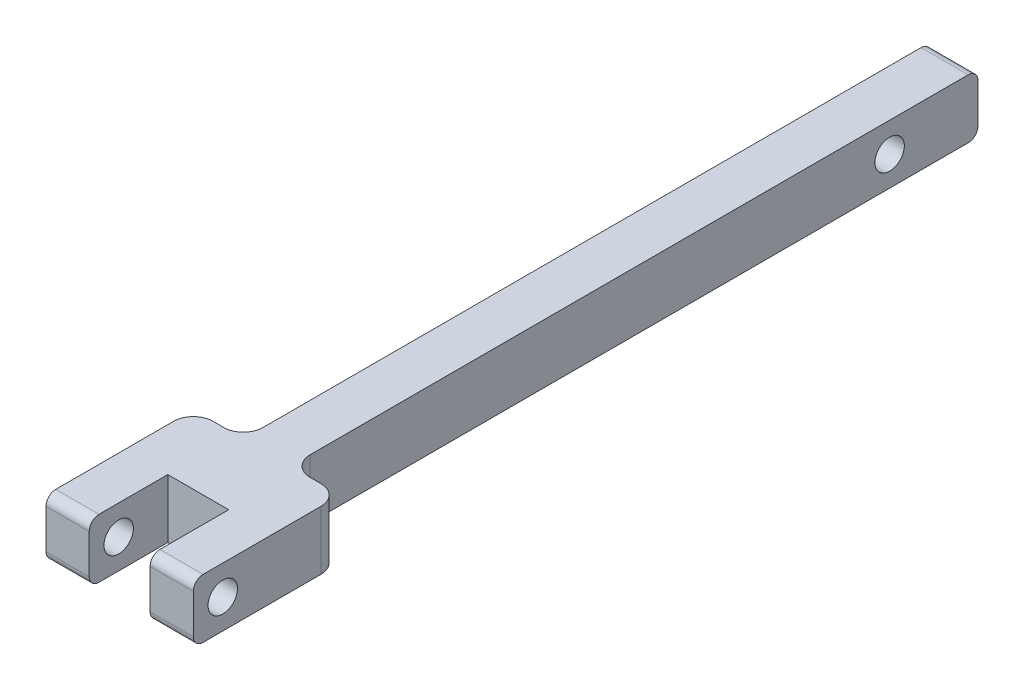
ISO-10303-21;
HEADER;
FILE_DESCRIPTION(('STEP AP214'),'2;1');
FILE_NAME('part.step','',(''),(''),'','','');
FILE_SCHEMA(('AUTOMOTIVE_DESIGN { 1 0 10303 214 1 1 1 1 }'));
ENDSEC;
DATA;
#1=APPLICATION_CONTEXT('core data for automotive mechanical design processes');
#2=APPLICATION_PROTOCOL_DEFINITION('international standard','automotive_design',2000,#1);
#3=PRODUCT_CONTEXT('',#1,'mechanical');
#4=PRODUCT('Part','Part','',(#3));
#5=PRODUCT_RELATED_PRODUCT_CATEGORY('part','',(#4));
#6=PRODUCT_DEFINITION_FORMATION('','',#4);
#7=PRODUCT_DEFINITION_CONTEXT('part definition',#1,'design');
#8=PRODUCT_DEFINITION('design','',#6,#7);
#9=PRODUCT_DEFINITION_SHAPE('','',#8);
#10=(LENGTH_UNIT() NAMED_UNIT(*) SI_UNIT(.MILLI.,.METRE.));
#11=(NAMED_UNIT(*) PLANE_ANGLE_UNIT() SI_UNIT($,.RADIAN.));
#12=(NAMED_UNIT(*) SI_UNIT($,.STERADIAN.) SOLID_ANGLE_UNIT());
#13=UNCERTAINTY_MEASURE_WITH_UNIT(LENGTH_MEASURE(1.E-05),#10,'distance_accuracy_value','');
#14=(GEOMETRIC_REPRESENTATION_CONTEXT(3) GLOBAL_UNCERTAINTY_ASSIGNED_CONTEXT((#13)) GLOBAL_UNIT_ASSIGNED_CONTEXT((#10,
#11,#12)) REPRESENTATION_CONTEXT('',''));
#15=CARTESIAN_POINT('',(0.,0.,0.));
#16=DIRECTION('',(0.,0.,1.));
#17=DIRECTION('',(1.,0.,0.));
#18=AXIS2_PLACEMENT_3D('',#15,#16,#17);
#19=CARTESIAN_POINT('',(2.4,-2.,41.5));
#20=DIRECTION('',(-1.,0.,0.));
#21=DIRECTION('',(0.,0.,1.));
#22=AXIS2_PLACEMENT_3D('',#19,#20,#21);
#23=CYLINDRICAL_SURFACE('',#22,1.);
#24=CARTESIAN_POINT('',(-3.1,-2.,41.5));
#25=DIRECTION('',(1.,0.,0.));
#26=DIRECTION('',(0.,0.,-1.));
#27=AXIS2_PLACEMENT_3D('',#24,#25,#26);
#28=CIRCLE('',#27,1.);
#29=CARTESIAN_POINT('',(-3.1,-2.,42.5));
#30=VERTEX_POINT('',#29);
#31=CARTESIAN_POINT('',(-3.1,-3.,41.5));
#32=VERTEX_POINT('',#31);
#33=EDGE_CURVE('E201',#30,#32,#28,.T.);
#34=ORIENTED_EDGE('',*,*,#33,.F.);
#35=DIRECTION('',(-1.,0.,0.));
#36=VECTOR('',#35,1.);
#37=CARTESIAN_POINT('',(2.4,-2.,42.5));
#38=LINE('',#37,#36);
#39=CARTESIAN_POINT('',(-7.5,-2.,42.5));
#40=VERTEX_POINT('',#39);
#41=EDGE_CURVE('E200',#30,#40,#38,.T.);
#42=ORIENTED_EDGE('',*,*,#41,.T.);
#43=CARTESIAN_POINT('',(-7.5,-2.,41.5));
#44=DIRECTION('',(1.,0.,0.));
#45=DIRECTION('',(0.,0.,-1.));
#46=AXIS2_PLACEMENT_3D('',#43,#44,#45);
#47=CIRCLE('',#46,1.);
#48=CARTESIAN_POINT('',(-7.5,-3.,41.5));
#49=VERTEX_POINT('',#48);
#50=EDGE_CURVE('E358',#40,#49,#47,.T.);
#51=ORIENTED_EDGE('',*,*,#50,.T.);
#52=DIRECTION('',(-1.,0.,0.));
#53=VECTOR('',#52,1.);
#54=CARTESIAN_POINT('',(2.4,-3.,41.5));
#55=LINE('',#54,#53);
#56=EDGE_CURVE('E231',#32,#49,#55,.T.);
#57=ORIENTED_EDGE('',*,*,#56,.F.);
#58=EDGE_LOOP('',(#34,#42,#51,#57));
#59=FACE_BOUND('',#58,.T.);
#60=ADVANCED_FACE('F32',(#59),#23,.T.);
#61=CARTESIAN_POINT('',(2.4,-3.,41.5));
#62=DIRECTION('',(0.,1.,0.));
#63=DIRECTION('',(0.,0.,1.));
#64=AXIS2_PLACEMENT_3D('',#61,#62,#63);
#65=PLANE('',#64);
#66=DIRECTION('',(-1.,0.,0.));
#67=VECTOR('',#66,1.);
#68=CARTESIAN_POINT('',(7.5,-3.,27.5));
#69=LINE('',#68,#67);
#70=CARTESIAN_POINT('',(5.5,-3.,27.5));
#71=VERTEX_POINT('',#70);
#72=CARTESIAN_POINT('',(4.4,-3.,27.5));
#73=VERTEX_POINT('',#72);
#74=EDGE_CURVE('E370',#71,#73,#69,.T.);
#75=ORIENTED_EDGE('',*,*,#74,.F.);
#76=CARTESIAN_POINT('',(5.5,-3.,29.5));
#77=DIRECTION('',(0.,1.,0.));
#78=DIRECTION('',(0.,0.,1.));
#79=AXIS2_PLACEMENT_3D('',#76,#77,#78);
#80=CIRCLE('',#79,2.);
#81=CARTESIAN_POINT('',(7.5,-3.,29.5));
#82=VERTEX_POINT('',#81);
#83=EDGE_CURVE('E256',#71,#82,#80,.F.);
#84=ORIENTED_EDGE('',*,*,#83,.T.);
#85=DIRECTION('',(0.,0.,-1.));
#86=VECTOR('',#85,1.);
#87=CARTESIAN_POINT('',(7.5,-3.,27.5));
#88=LINE('',#87,#86);
#89=CARTESIAN_POINT('',(7.5,-3.,41.5));
#90=VERTEX_POINT('',#89);
#91=EDGE_CURVE('E344',#90,#82,#88,.T.);
#92=ORIENTED_EDGE('',*,*,#91,.F.);
#93=CARTESIAN_POINT('',(3.1,-3.,41.5));
#94=VERTEX_POINT('',#93);
#95=EDGE_CURVE('E232',#90,#94,#55,.T.);
#96=ORIENTED_EDGE('',*,*,#95,.T.);
#97=DIRECTION('',(0.,0.,-1.));
#98=VECTOR('',#97,1.);
#99=CARTESIAN_POINT('',(3.1,-3.,34.5));
#100=LINE('',#99,#98);
#101=CARTESIAN_POINT('',(3.1,-3.,34.5));
#102=VERTEX_POINT('',#101);
#103=EDGE_CURVE('E428',#94,#102,#100,.T.);
#104=ORIENTED_EDGE('',*,*,#103,.T.);
#105=DIRECTION('',(1.,0.,0.));
#106=VECTOR('',#105,1.);
#107=CARTESIAN_POINT('',(-3.1,-3.,34.5));
#108=LINE('',#107,#106);
#109=CARTESIAN_POINT('',(-3.1,-3.,34.5));
#110=VERTEX_POINT('',#109);
#111=EDGE_CURVE('E422',#110,#102,#108,.T.);
#112=ORIENTED_EDGE('',*,*,#111,.F.);
#113=DIRECTION('',(0.,0.,-1.));
#114=VECTOR('',#113,1.);
#115=CARTESIAN_POINT('',(-3.1,-3.,34.5));
#116=LINE('',#115,#114);
#117=EDGE_CURVE('E415',#32,#110,#116,.T.);
#118=ORIENTED_EDGE('',*,*,#117,.F.);
#119=ORIENTED_EDGE('',*,*,#56,.T.);
#120=DIRECTION('',(0.,0.,-1.));
#121=VECTOR('',#120,1.);
#122=CARTESIAN_POINT('',(-7.5,-3.,27.5));
#123=LINE('',#122,#121);
#124=CARTESIAN_POINT('',(-7.5,-3.,29.5));
#125=VERTEX_POINT('',#124);
#126=EDGE_CURVE('E361',#49,#125,#123,.T.);
#127=ORIENTED_EDGE('',*,*,#126,.T.);
#128=CARTESIAN_POINT('',(-5.5,-3.,29.5));
#129=DIRECTION('',(0.,1.,0.));
#130=DIRECTION('',(0.,0.,1.));
#131=AXIS2_PLACEMENT_3D('',#128,#129,#130);
#132=CIRCLE('',#131,2.);
#133=CARTESIAN_POINT('',(-5.5,-3.,27.5));
#134=VERTEX_POINT('',#133);
#135=EDGE_CURVE('E254',#125,#134,#132,.F.);
#136=ORIENTED_EDGE('',*,*,#135,.T.);
#137=CARTESIAN_POINT('',(-4.4,-3.,27.5));
#138=VERTEX_POINT('',#137);
#139=EDGE_CURVE('E367',#138,#134,#69,.T.);
#140=ORIENTED_EDGE('',*,*,#139,.F.);
#141=CARTESIAN_POINT('',(-4.4,-3.,25.5));
#142=DIRECTION('',(0.,1.,0.));
#143=DIRECTION('',(0.,0.,1.));
#144=AXIS2_PLACEMENT_3D('',#141,#142,#143);
#145=CIRCLE('',#144,2.);
#146=CARTESIAN_POINT('',(-2.4,-3.,25.5));
#147=VERTEX_POINT('',#146);
#148=EDGE_CURVE('E40',#138,#147,#145,.T.);
#149=ORIENTED_EDGE('',*,*,#148,.T.);
#150=DIRECTION('',(0.,0.,-1.));
#151=VECTOR('',#150,1.);
#152=CARTESIAN_POINT('',(-2.4,-3.,41.5));
#153=LINE('',#152,#151);
#154=CARTESIAN_POINT('',(-2.4,-3.,-41.5));
#155=VERTEX_POINT('',#154);
#156=EDGE_CURVE('E377',#147,#155,#153,.T.);
#157=ORIENTED_EDGE('',*,*,#156,.T.);
#158=DIRECTION('',(-1.,0.,0.));
#159=VECTOR('',#158,1.);
#160=CARTESIAN_POINT('',(2.4,-3.,-41.5));
#161=LINE('',#160,#159);
#162=CARTESIAN_POINT('',(2.4,-3.,-41.5));
#163=VERTEX_POINT('',#162);
#164=EDGE_CURVE('E228',#163,#155,#161,.T.);
#165=ORIENTED_EDGE('',*,*,#164,.F.);
#166=DIRECTION('',(0.,0.,-1.));
#167=VECTOR('',#166,1.);
#168=CARTESIAN_POINT('',(2.4,-3.,41.5));
#169=LINE('',#168,#167);
#170=CARTESIAN_POINT('',(2.4,-3.,25.5));
#171=VERTEX_POINT('',#170);
#172=EDGE_CURVE('E378',#171,#163,#169,.T.);
#173=ORIENTED_EDGE('',*,*,#172,.F.);
#174=CARTESIAN_POINT('',(4.4,-3.,25.5));
#175=DIRECTION('',(0.,1.,0.));
#176=DIRECTION('',(0.,0.,1.));
#177=AXIS2_PLACEMENT_3D('',#174,#175,#176);
#178=CIRCLE('',#177,2.);
#179=EDGE_CURVE('E47',#171,#73,#178,.T.);
#180=ORIENTED_EDGE('',*,*,#179,.T.);
#181=EDGE_LOOP('',(#75,#84,#92,#96,#104,#112,#118,#119,#127,#136,#140,#149,#157,#165,#173,#180));
#182=FACE_BOUND('',#181,.T.);
#183=ADVANCED_FACE('F301',(#182),#65,.F.);
#184=CARTESIAN_POINT('',(2.4,3.,41.5));
#185=DIRECTION('',(0.,-1.,0.));
#186=DIRECTION('',(0.,0.,-1.));
#187=AXIS2_PLACEMENT_3D('',#184,#185,#186);
#188=PLANE('',#187);
#189=DIRECTION('',(0.,0.,1.));
#190=VECTOR('',#189,1.);
#191=CARTESIAN_POINT('',(7.5,3.,41.5));
#192=LINE('',#191,#190);
#193=CARTESIAN_POINT('',(7.5,3.,29.5));
#194=VERTEX_POINT('',#193);
#195=CARTESIAN_POINT('',(7.5,3.,41.5));
#196=VERTEX_POINT('',#195);
#197=EDGE_CURVE('E351',#194,#196,#192,.T.);
#198=ORIENTED_EDGE('',*,*,#197,.F.);
#199=CARTESIAN_POINT('',(5.5,3.,29.5));
#200=DIRECTION('',(0.,-1.,0.));
#201=DIRECTION('',(0.,0.,-1.));
#202=AXIS2_PLACEMENT_3D('',#199,#200,#201);
#203=CIRCLE('',#202,2.);
#204=CARTESIAN_POINT('',(5.5,3.,27.5));
#205=VERTEX_POINT('',#204);
#206=EDGE_CURVE('E248',#194,#205,#203,.F.);
#207=ORIENTED_EDGE('',*,*,#206,.T.);
#208=DIRECTION('',(-1.,0.,0.));
#209=VECTOR('',#208,1.);
#210=CARTESIAN_POINT('',(7.5,3.,27.5));
#211=LINE('',#210,#209);
#212=CARTESIAN_POINT('',(4.4,3.,27.5));
#213=VERTEX_POINT('',#212);
#214=EDGE_CURVE('E281',#205,#213,#211,.T.);
#215=ORIENTED_EDGE('',*,*,#214,.T.);
#216=CARTESIAN_POINT('',(4.4,3.,25.5));
#217=DIRECTION('',(0.,-1.,0.));
#218=DIRECTION('',(0.,0.,-1.));
#219=AXIS2_PLACEMENT_3D('',#216,#217,#218);
#220=CIRCLE('',#219,2.);
#221=CARTESIAN_POINT('',(2.4,3.,25.5));
#222=VERTEX_POINT('',#221);
#223=EDGE_CURVE('E271',#213,#222,#220,.T.);
#224=ORIENTED_EDGE('',*,*,#223,.T.);
#225=DIRECTION('',(0.,0.,1.));
#226=VECTOR('',#225,1.);
#227=CARTESIAN_POINT('',(2.4,3.,41.5));
#228=LINE('',#227,#226);
#229=CARTESIAN_POINT('',(2.4,3.,-41.5));
#230=VERTEX_POINT('',#229);
#231=EDGE_CURVE('E279',#230,#222,#228,.T.);
#232=ORIENTED_EDGE('',*,*,#231,.F.);
#233=DIRECTION('',(-1.,0.,0.));
#234=VECTOR('',#233,1.);
#235=CARTESIAN_POINT('',(2.4,3.,-41.5));
#236=LINE('',#235,#234);
#237=CARTESIAN_POINT('',(-2.4,3.,-41.5));
#238=VERTEX_POINT('',#237);
#239=EDGE_CURVE('E219',#230,#238,#236,.T.);
#240=ORIENTED_EDGE('',*,*,#239,.T.);
#241=DIRECTION('',(0.,0.,1.));
#242=VECTOR('',#241,1.);
#243=CARTESIAN_POINT('',(-2.4,3.,41.5));
#244=LINE('',#243,#242);
#245=CARTESIAN_POINT('',(-2.4,3.,25.5));
#246=VERTEX_POINT('',#245);
#247=EDGE_CURVE('E381',#238,#246,#244,.T.);
#248=ORIENTED_EDGE('',*,*,#247,.T.);
#249=CARTESIAN_POINT('',(-4.4,3.,25.5));
#250=DIRECTION('',(0.,-1.,0.));
#251=DIRECTION('',(0.,0.,-1.));
#252=AXIS2_PLACEMENT_3D('',#249,#250,#251);
#253=CIRCLE('',#252,2.);
#254=CARTESIAN_POINT('',(-4.4,3.,27.5));
#255=VERTEX_POINT('',#254);
#256=EDGE_CURVE('E11',#246,#255,#253,.T.);
#257=ORIENTED_EDGE('',*,*,#256,.T.);
#258=CARTESIAN_POINT('',(-5.5,3.,27.5));
#259=VERTEX_POINT('',#258);
#260=EDGE_CURVE('E353',#255,#259,#211,.T.);
#261=ORIENTED_EDGE('',*,*,#260,.T.);
#262=CARTESIAN_POINT('',(-5.5,3.,29.5));
#263=DIRECTION('',(0.,-1.,0.));
#264=DIRECTION('',(0.,0.,-1.));
#265=AXIS2_PLACEMENT_3D('',#262,#263,#264);
#266=CIRCLE('',#265,2.);
#267=CARTESIAN_POINT('',(-7.5,3.,29.5));
#268=VERTEX_POINT('',#267);
#269=EDGE_CURVE('E246',#259,#268,#266,.F.);
#270=ORIENTED_EDGE('',*,*,#269,.T.);
#271=DIRECTION('',(0.,0.,1.));
#272=VECTOR('',#271,1.);
#273=CARTESIAN_POINT('',(-7.5,3.,41.5));
#274=LINE('',#273,#272);
#275=CARTESIAN_POINT('',(-7.5,3.,41.5));
#276=VERTEX_POINT('',#275);
#277=EDGE_CURVE('E346',#268,#276,#274,.T.);
#278=ORIENTED_EDGE('',*,*,#277,.T.);
#279=DIRECTION('',(-1.,0.,0.));
#280=VECTOR('',#279,1.);
#281=CARTESIAN_POINT('',(2.4,3.,41.5));
#282=LINE('',#281,#280);
#283=CARTESIAN_POINT('',(-3.1,3.,41.5));
#284=VERTEX_POINT('',#283);
#285=EDGE_CURVE('E211',#284,#276,#282,.T.);
#286=ORIENTED_EDGE('',*,*,#285,.F.);
#287=DIRECTION('',(0.,0.,1.));
#288=VECTOR('',#287,1.);
#289=CARTESIAN_POINT('',(-3.1,3.,41.5));
#290=LINE('',#289,#288);
#291=CARTESIAN_POINT('',(-3.1,3.,34.5));
#292=VERTEX_POINT('',#291);
#293=EDGE_CURVE('E187',#292,#284,#290,.T.);
#294=ORIENTED_EDGE('',*,*,#293,.F.);
#295=DIRECTION('',(1.,0.,0.));
#296=VECTOR('',#295,1.);
#297=CARTESIAN_POINT('',(-3.1,3.,34.5));
#298=LINE('',#297,#296);
#299=CARTESIAN_POINT('',(3.1,3.,34.5));
#300=VERTEX_POINT('',#299);
#301=EDGE_CURVE('E240',#292,#300,#298,.T.);
#302=ORIENTED_EDGE('',*,*,#301,.T.);
#303=DIRECTION('',(0.,0.,1.));
#304=VECTOR('',#303,1.);
#305=CARTESIAN_POINT('',(3.1,3.,41.5));
#306=LINE('',#305,#304);
#307=CARTESIAN_POINT('',(3.1,3.,41.5));
#308=VERTEX_POINT('',#307);
#309=EDGE_CURVE('E192',#300,#308,#306,.T.);
#310=ORIENTED_EDGE('',*,*,#309,.T.);
#311=EDGE_CURVE('E216',#196,#308,#282,.T.);
#312=ORIENTED_EDGE('',*,*,#311,.F.);
#313=EDGE_LOOP('',(#198,#207,#215,#224,#232,#240,#248,#257,#261,#270,#278,#286,#294,#302,#310,#312));
#314=FACE_BOUND('',#313,.T.);
#315=ADVANCED_FACE('F278',(#314),#188,.F.);
#316=CARTESIAN_POINT('',(2.4,2.,41.5));
#317=DIRECTION('',(-1.,0.,0.));
#318=DIRECTION('',(0.,0.,1.));
#319=AXIS2_PLACEMENT_3D('',#316,#317,#318);
#320=CYLINDRICAL_SURFACE('',#319,1.);
#321=CARTESIAN_POINT('',(-3.1,2.,41.5));
#322=DIRECTION('',(1.,0.,0.));
#323=DIRECTION('',(0.,0.,-1.));
#324=AXIS2_PLACEMENT_3D('',#321,#322,#323);
#325=CIRCLE('',#324,1.);
#326=CARTESIAN_POINT('',(-3.1,2.,42.5));
#327=VERTEX_POINT('',#326);
#328=EDGE_CURVE('E179',#284,#327,#325,.T.);
#329=ORIENTED_EDGE('',*,*,#328,.F.);
#330=ORIENTED_EDGE('',*,*,#285,.T.);
#331=CARTESIAN_POINT('',(-7.5,2.,41.5));
#332=DIRECTION('',(1.,0.,0.));
#333=DIRECTION('',(0.,0.,-1.));
#334=AXIS2_PLACEMENT_3D('',#331,#332,#333);
#335=CIRCLE('',#334,1.);
#336=CARTESIAN_POINT('',(-7.5,2.,42.5));
#337=VERTEX_POINT('',#336);
#338=EDGE_CURVE('E206',#276,#337,#335,.T.);
#339=ORIENTED_EDGE('',*,*,#338,.T.);
#340=DIRECTION('',(-1.,0.,0.));
#341=VECTOR('',#340,1.);
#342=CARTESIAN_POINT('',(2.4,2.,42.5));
#343=LINE('',#342,#341);
#344=EDGE_CURVE('E198',#327,#337,#343,.T.);
#345=ORIENTED_EDGE('',*,*,#344,.F.);
#346=EDGE_LOOP('',(#329,#330,#339,#345));
#347=FACE_BOUND('',#346,.T.);
#348=ADVANCED_FACE('F204',(#347),#320,.T.);
#349=CARTESIAN_POINT('',(2.4,2.,42.5));
#350=DIRECTION('',(0.,0.,-1.));
#351=DIRECTION('',(-1.,0.,0.));
#352=AXIS2_PLACEMENT_3D('',#349,#350,#351);
#353=PLANE('',#352);
#354=DIRECTION('',(0.,-1.,0.));
#355=VECTOR('',#354,1.);
#356=CARTESIAN_POINT('',(-3.1,2.,42.5));
#357=LINE('',#356,#355);
#358=EDGE_CURVE('E183',#327,#30,#357,.T.);
#359=ORIENTED_EDGE('',*,*,#358,.F.);
#360=ORIENTED_EDGE('',*,*,#344,.T.);
#361=DIRECTION('',(0.,-1.,0.));
#362=VECTOR('',#361,1.);
#363=CARTESIAN_POINT('',(-7.5,2.,42.5));
#364=LINE('',#363,#362);
#365=EDGE_CURVE('E355',#337,#40,#364,.T.);
#366=ORIENTED_EDGE('',*,*,#365,.T.);
#367=ORIENTED_EDGE('',*,*,#41,.F.);
#368=EDGE_LOOP('',(#359,#360,#366,#367));
#369=FACE_BOUND('',#368,.T.);
#370=ADVANCED_FACE('F196',(#369),#353,.F.);
#371=CARTESIAN_POINT('',(-2.4,0.,39.5));
#372=DIRECTION('',(1.,0.,0.));
#373=DIRECTION('',(0.,0.,-1.));
#374=AXIS2_PLACEMENT_3D('',#371,#372,#373);
#375=CYLINDRICAL_SURFACE('',#374,1.5);
#376=CARTESIAN_POINT('',(-7.5,0.,39.5));
#377=DIRECTION('',(1.,0.,0.));
#378=DIRECTION('',(0.,0.,-1.));
#379=AXIS2_PLACEMENT_3D('',#376,#377,#378);
#380=CIRCLE('',#379,1.5);
#381=CARTESIAN_POINT('',(-7.5,0.,38.));
#382=VERTEX_POINT('',#381);
#383=EDGE_CURVE('E243',#382,#382,#380,.T.);
#384=ORIENTED_EDGE('',*,*,#383,.F.);
#385=EDGE_LOOP('',(#384));
#386=FACE_BOUND('',#385,.T.);
#387=CARTESIAN_POINT('',(-3.1,0.,39.5));
#388=DIRECTION('',(1.,0.,0.));
#389=DIRECTION('',(0.,0.,-1.));
#390=AXIS2_PLACEMENT_3D('',#387,#388,#389);
#391=CIRCLE('',#390,1.5);
#392=CARTESIAN_POINT('',(-3.1,0.,38.));
#393=VERTEX_POINT('',#392);
#394=EDGE_CURVE('E239',#393,#393,#391,.F.);
#395=ORIENTED_EDGE('',*,*,#394,.F.);
#396=EDGE_LOOP('',(#395));
#397=FACE_BOUND('',#396,.T.);
#398=ADVANCED_FACE('F442',(#386,#397),#375,.F.);
#399=CARTESIAN_POINT('',(2.4,-2.,41.5));
#400=DIRECTION('',(1.,0.,0.));
#401=DIRECTION('',(0.,0.,-1.));
#402=AXIS2_PLACEMENT_3D('',#399,#400,#401);
#403=PLANE('',#402);
#404=CARTESIAN_POINT('',(2.4,0.,-33.5));
#405=DIRECTION('',(1.,0.,0.));
#406=DIRECTION('',(0.,0.,-1.));
#407=AXIS2_PLACEMENT_3D('',#404,#405,#406);
#408=CIRCLE('',#407,1.5);
#409=CARTESIAN_POINT('',(2.4,0.,-35.));
#410=VERTEX_POINT('',#409);
#411=EDGE_CURVE('E371',#410,#410,#408,.T.);
#412=ORIENTED_EDGE('',*,*,#411,.F.);
#413=EDGE_LOOP('',(#412));
#414=FACE_BOUND('',#413,.T.);
#415=ORIENTED_EDGE('',*,*,#231,.T.);
#416=DIRECTION('',(0.,-1.,0.));
#417=VECTOR('',#416,1.);
#418=CARTESIAN_POINT('',(2.4,-2.,25.5));
#419=LINE('',#418,#417);
#420=EDGE_CURVE('E266',#222,#171,#419,.T.);
#421=ORIENTED_EDGE('',*,*,#420,.T.);
#422=ORIENTED_EDGE('',*,*,#172,.T.);
#423=CARTESIAN_POINT('',(2.4,-2.,-41.5));
#424=DIRECTION('',(1.,0.,0.));
#425=DIRECTION('',(0.,0.,-1.));
#426=AXIS2_PLACEMENT_3D('',#423,#424,#425);
#427=CIRCLE('',#426,1.);
#428=CARTESIAN_POINT('',(2.4,-2.,-42.5));
#429=VERTEX_POINT('',#428);
#430=EDGE_CURVE('E380',#163,#429,#427,.T.);
#431=ORIENTED_EDGE('',*,*,#430,.T.);
#432=DIRECTION('',(0.,1.,0.));
#433=VECTOR('',#432,1.);
#434=CARTESIAN_POINT('',(2.4,2.,-42.5));
#435=LINE('',#434,#433);
#436=CARTESIAN_POINT('',(2.4,2.,-42.5));
#437=VERTEX_POINT('',#436);
#438=EDGE_CURVE('E383',#429,#437,#435,.T.);
#439=ORIENTED_EDGE('',*,*,#438,.T.);
#440=CARTESIAN_POINT('',(2.4,2.,-41.5));
#441=DIRECTION('',(1.,0.,0.));
#442=DIRECTION('',(0.,0.,1.));
#443=AXIS2_PLACEMENT_3D('',#440,#441,#442);
#444=CIRCLE('',#443,1.);
#445=EDGE_CURVE('E286',#437,#230,#444,.T.);
#446=ORIENTED_EDGE('',*,*,#445,.T.);
#447=EDGE_LOOP('',(#415,#421,#422,#431,#439,#446));
#448=FACE_BOUND('',#447,.T.);
#449=ADVANCED_FACE('F283',(#414,#448),#403,.T.);
#450=CARTESIAN_POINT('',(-2.4,-2.,41.5));
#451=DIRECTION('',(1.,0.,0.));
#452=DIRECTION('',(0.,0.,-1.));
#453=AXIS2_PLACEMENT_3D('',#450,#451,#452);
#454=PLANE('',#453);
#455=CARTESIAN_POINT('',(-2.4,0.,-33.5));
#456=DIRECTION('',(1.,0.,0.));
#457=DIRECTION('',(0.,0.,-1.));
#458=AXIS2_PLACEMENT_3D('',#455,#456,#457);
#459=CIRCLE('',#458,1.5);
#460=CARTESIAN_POINT('',(-2.4,0.,-35.));
#461=VERTEX_POINT('',#460);
#462=EDGE_CURVE('E374',#461,#461,#459,.T.);
#463=ORIENTED_EDGE('',*,*,#462,.T.);
#464=EDGE_LOOP('',(#463));
#465=FACE_BOUND('',#464,.T.);
#466=ORIENTED_EDGE('',*,*,#156,.F.);
#467=DIRECTION('',(0.,-1.,0.));
#468=VECTOR('',#467,1.);
#469=CARTESIAN_POINT('',(-2.4,3.,25.5));
#470=LINE('',#469,#468);
#471=EDGE_CURVE('E268',#147,#246,#470,.F.);
#472=ORIENTED_EDGE('',*,*,#471,.T.);
#473=ORIENTED_EDGE('',*,*,#247,.F.);
#474=CARTESIAN_POINT('',(-2.4,2.,-41.5));
#475=DIRECTION('',(1.,0.,0.));
#476=DIRECTION('',(0.,0.,1.));
#477=AXIS2_PLACEMENT_3D('',#474,#475,#476);
#478=CIRCLE('',#477,1.);
#479=CARTESIAN_POINT('',(-2.4,2.,-42.5));
#480=VERTEX_POINT('',#479);
#481=EDGE_CURVE('E391',#480,#238,#478,.T.);
#482=ORIENTED_EDGE('',*,*,#481,.F.);
#483=DIRECTION('',(0.,1.,0.));
#484=VECTOR('',#483,1.);
#485=CARTESIAN_POINT('',(-2.4,2.,-42.5));
#486=LINE('',#485,#484);
#487=CARTESIAN_POINT('',(-2.4,-2.,-42.5));
#488=VERTEX_POINT('',#487);
#489=EDGE_CURVE('E389',#488,#480,#486,.T.);
#490=ORIENTED_EDGE('',*,*,#489,.F.);
#491=CARTESIAN_POINT('',(-2.4,-2.,-41.5));
#492=DIRECTION('',(1.,0.,0.));
#493=DIRECTION('',(0.,0.,-1.));
#494=AXIS2_PLACEMENT_3D('',#491,#492,#493);
#495=CIRCLE('',#494,1.);
#496=EDGE_CURVE('E387',#155,#488,#495,.T.);
#497=ORIENTED_EDGE('',*,*,#496,.F.);
#498=EDGE_LOOP('',(#466,#472,#473,#482,#490,#497));
#499=FACE_BOUND('',#498,.T.);
#500=ADVANCED_FACE('F312',(#465,#499),#454,.F.);
#501=CARTESIAN_POINT('',(7.5,-2.,42.5));
#502=VERTEX_POINT('',#501);
#503=CARTESIAN_POINT('',(3.1,-2.,42.5));
#504=VERTEX_POINT('',#503);
#505=EDGE_CURVE('E208',#502,#504,#38,.T.);
#506=ORIENTED_EDGE('',*,*,#505,.T.);
#507=CARTESIAN_POINT('',(3.1,-2.,41.5));
#508=DIRECTION('',(1.,0.,0.));
#509=DIRECTION('',(0.,0.,-1.));
#510=AXIS2_PLACEMENT_3D('',#507,#508,#509);
#511=CIRCLE('',#510,1.);
#512=EDGE_CURVE('E325',#504,#94,#511,.T.);
#513=ORIENTED_EDGE('',*,*,#512,.T.);
#514=ORIENTED_EDGE('',*,*,#95,.F.);
#515=CARTESIAN_POINT('',(7.5,-2.,41.5));
#516=DIRECTION('',(1.,0.,0.));
#517=DIRECTION('',(0.,0.,-1.));
#518=AXIS2_PLACEMENT_3D('',#515,#516,#517);
#519=CIRCLE('',#518,1.);
#520=EDGE_CURVE('E327',#502,#90,#519,.T.);
#521=ORIENTED_EDGE('',*,*,#520,.F.);
#522=EDGE_LOOP('',(#506,#513,#514,#521));
#523=FACE_BOUND('',#522,.T.);
#524=ADVANCED_FACE('F304',(#523),#23,.T.);
#525=CARTESIAN_POINT('',(2.4,-2.,-41.5));
#526=DIRECTION('',(-1.,0.,0.));
#527=DIRECTION('',(0.,0.,1.));
#528=AXIS2_PLACEMENT_3D('',#525,#526,#527);
#529=CYLINDRICAL_SURFACE('',#528,1.);
#530=ORIENTED_EDGE('',*,*,#496,.T.);
#531=DIRECTION('',(-1.,0.,0.));
#532=VECTOR('',#531,1.);
#533=CARTESIAN_POINT('',(2.4,-2.,-42.5));
#534=LINE('',#533,#532);
#535=EDGE_CURVE('E225',#429,#488,#534,.T.);
#536=ORIENTED_EDGE('',*,*,#535,.F.);
#537=ORIENTED_EDGE('',*,*,#430,.F.);
#538=ORIENTED_EDGE('',*,*,#164,.T.);
#539=EDGE_LOOP('',(#530,#536,#537,#538));
#540=FACE_BOUND('',#539,.T.);
#541=ADVANCED_FACE('F311',(#540),#529,.T.);
#542=CARTESIAN_POINT('',(2.4,2.,-42.5));
#543=DIRECTION('',(0.,0.,1.));
#544=DIRECTION('',(1.,0.,0.));
#545=AXIS2_PLACEMENT_3D('',#542,#543,#544);
#546=PLANE('',#545);
#547=ORIENTED_EDGE('',*,*,#489,.T.);
#548=DIRECTION('',(-1.,0.,0.));
#549=VECTOR('',#548,1.);
#550=CARTESIAN_POINT('',(2.4,2.,-42.5));
#551=LINE('',#550,#549);
#552=EDGE_CURVE('E222',#437,#480,#551,.T.);
#553=ORIENTED_EDGE('',*,*,#552,.F.);
#554=ORIENTED_EDGE('',*,*,#438,.F.);
#555=ORIENTED_EDGE('',*,*,#535,.T.);
#556=EDGE_LOOP('',(#547,#553,#554,#555));
#557=FACE_BOUND('',#556,.T.);
#558=ADVANCED_FACE('F318',(#557),#546,.F.);
#559=CARTESIAN_POINT('',(2.4,2.,-41.5));
#560=DIRECTION('',(-1.,0.,0.));
#561=DIRECTION('',(0.,0.,1.));
#562=AXIS2_PLACEMENT_3D('',#559,#560,#561);
#563=CYLINDRICAL_SURFACE('',#562,1.);
#564=ORIENTED_EDGE('',*,*,#481,.T.);
#565=ORIENTED_EDGE('',*,*,#239,.F.);
#566=ORIENTED_EDGE('',*,*,#445,.F.);
#567=ORIENTED_EDGE('',*,*,#552,.T.);
#568=EDGE_LOOP('',(#564,#565,#566,#567));
#569=FACE_BOUND('',#568,.T.);
#570=ADVANCED_FACE('F483',(#569),#563,.T.);
#571=ORIENTED_EDGE('',*,*,#311,.T.);
#572=CARTESIAN_POINT('',(3.1,2.,41.5));
#573=DIRECTION('',(1.,0.,0.));
#574=DIRECTION('',(0.,0.,-1.));
#575=AXIS2_PLACEMENT_3D('',#572,#573,#574);
#576=CIRCLE('',#575,1.);
#577=CARTESIAN_POINT('',(3.1,2.,42.5));
#578=VERTEX_POINT('',#577);
#579=EDGE_CURVE('E423',#308,#578,#576,.T.);
#580=ORIENTED_EDGE('',*,*,#579,.T.);
#581=CARTESIAN_POINT('',(7.5,2.,42.5));
#582=VERTEX_POINT('',#581);
#583=EDGE_CURVE('E207',#582,#578,#343,.T.);
#584=ORIENTED_EDGE('',*,*,#583,.F.);
#585=CARTESIAN_POINT('',(7.5,2.,41.5));
#586=DIRECTION('',(1.,0.,0.));
#587=DIRECTION('',(0.,0.,-1.));
#588=AXIS2_PLACEMENT_3D('',#585,#586,#587);
#589=CIRCLE('',#588,1.);
#590=EDGE_CURVE('E342',#196,#582,#589,.T.);
#591=ORIENTED_EDGE('',*,*,#590,.F.);
#592=EDGE_LOOP('',(#571,#580,#584,#591));
#593=FACE_BOUND('',#592,.T.);
#594=ADVANCED_FACE('F480',(#593),#320,.T.);
#595=ORIENTED_EDGE('',*,*,#583,.T.);
#596=DIRECTION('',(0.,-1.,0.));
#597=VECTOR('',#596,1.);
#598=CARTESIAN_POINT('',(3.1,2.,42.5));
#599=LINE('',#598,#597);
#600=EDGE_CURVE('E335',#578,#504,#599,.T.);
#601=ORIENTED_EDGE('',*,*,#600,.T.);
#602=ORIENTED_EDGE('',*,*,#505,.F.);
#603=DIRECTION('',(0.,-1.,0.));
#604=VECTOR('',#603,1.);
#605=CARTESIAN_POINT('',(7.5,2.,42.5));
#606=LINE('',#605,#604);
#607=EDGE_CURVE('E333',#582,#502,#606,.T.);
#608=ORIENTED_EDGE('',*,*,#607,.F.);
#609=EDGE_LOOP('',(#595,#601,#602,#608));
#610=FACE_BOUND('',#609,.T.);
#611=ADVANCED_FACE('F332',(#610),#353,.F.);
#612=CARTESIAN_POINT('',(-2.4,0.,-33.5));
#613=DIRECTION('',(1.,0.,0.));
#614=DIRECTION('',(0.,0.,-1.));
#615=AXIS2_PLACEMENT_3D('',#612,#613,#614);
#616=CYLINDRICAL_SURFACE('',#615,1.5);
#617=ORIENTED_EDGE('',*,*,#462,.F.);
#618=EDGE_LOOP('',(#617));
#619=FACE_BOUND('',#618,.T.);
#620=ORIENTED_EDGE('',*,*,#411,.T.);
#621=EDGE_LOOP('',(#620));
#622=FACE_BOUND('',#621,.T.);
#623=ADVANCED_FACE('F471',(#619,#622),#616,.F.);
#624=CARTESIAN_POINT('',(7.5,3.,27.5));
#625=DIRECTION('',(0.,0.,1.));
#626=DIRECTION('',(1.,0.,0.));
#627=AXIS2_PLACEMENT_3D('',#624,#625,#626);
#628=PLANE('',#627);
#629=ORIENTED_EDGE('',*,*,#139,.T.);
#630=DIRECTION('',(0.,1.,0.));
#631=VECTOR('',#630,1.);
#632=CARTESIAN_POINT('',(-5.5,3.,27.5));
#633=LINE('',#632,#631);
#634=EDGE_CURVE('E261',#134,#259,#633,.T.);
#635=ORIENTED_EDGE('',*,*,#634,.T.);
#636=ORIENTED_EDGE('',*,*,#260,.F.);
#637=DIRECTION('',(0.,-1.,0.));
#638=VECTOR('',#637,1.);
#639=CARTESIAN_POINT('',(-4.4,-3.,27.5));
#640=LINE('',#639,#638);
#641=EDGE_CURVE('E258',#255,#138,#640,.T.);
#642=ORIENTED_EDGE('',*,*,#641,.T.);
#643=EDGE_LOOP('',(#629,#635,#636,#642));
#644=FACE_BOUND('',#643,.T.);
#645=ADVANCED_FACE('F401',(#644),#628,.F.);
#646=CARTESIAN_POINT('',(-7.5,2.,41.5));
#647=DIRECTION('',(1.,0.,0.));
#648=DIRECTION('',(0.,0.,-1.));
#649=AXIS2_PLACEMENT_3D('',#646,#647,#648);
#650=PLANE('',#649);
#651=ORIENTED_EDGE('',*,*,#277,.F.);
#652=DIRECTION('',(0.,1.,0.));
#653=VECTOR('',#652,1.);
#654=CARTESIAN_POINT('',(-7.5,2.,29.5));
#655=LINE('',#654,#653);
#656=EDGE_CURVE('E264',#268,#125,#655,.F.);
#657=ORIENTED_EDGE('',*,*,#656,.T.);
#658=ORIENTED_EDGE('',*,*,#126,.F.);
#659=ORIENTED_EDGE('',*,*,#50,.F.);
#660=ORIENTED_EDGE('',*,*,#365,.F.);
#661=ORIENTED_EDGE('',*,*,#338,.F.);
#662=EDGE_LOOP('',(#651,#657,#658,#659,#660,#661));
#663=FACE_BOUND('',#662,.T.);
#664=ORIENTED_EDGE('',*,*,#383,.T.);
#665=EDGE_LOOP('',(#664));
#666=FACE_BOUND('',#665,.T.);
#667=ADVANCED_FACE('F409',(#663,#666),#650,.F.);
#668=CARTESIAN_POINT('',(3.1,0.,39.5));
#669=DIRECTION('',(1.,0.,0.));
#670=DIRECTION('',(0.,0.,-1.));
#671=AXIS2_PLACEMENT_3D('',#668,#669,#670);
#672=CIRCLE('',#671,1.5);
#673=CARTESIAN_POINT('',(3.1,0.,38.));
#674=VERTEX_POINT('',#673);
#675=EDGE_CURVE('E236',#674,#674,#672,.F.);
#676=ORIENTED_EDGE('',*,*,#675,.T.);
#677=EDGE_LOOP('',(#676));
#678=FACE_BOUND('',#677,.T.);
#679=CARTESIAN_POINT('',(7.5,0.,39.5));
#680=DIRECTION('',(1.,0.,0.));
#681=DIRECTION('',(0.,0.,-1.));
#682=AXIS2_PLACEMENT_3D('',#679,#680,#681);
#683=CIRCLE('',#682,1.5);
#684=CARTESIAN_POINT('',(7.5,0.,38.));
#685=VERTEX_POINT('',#684);
#686=EDGE_CURVE('E356',#685,#685,#683,.T.);
#687=ORIENTED_EDGE('',*,*,#686,.T.);
#688=EDGE_LOOP('',(#687));
#689=FACE_BOUND('',#688,.T.);
#690=ADVANCED_FACE('F446',(#678,#689),#375,.F.);
#691=CARTESIAN_POINT('',(7.5,2.,41.5));
#692=DIRECTION('',(1.,0.,0.));
#693=DIRECTION('',(0.,0.,-1.));
#694=AXIS2_PLACEMENT_3D('',#691,#692,#693);
#695=PLANE('',#694);
#696=ORIENTED_EDGE('',*,*,#91,.T.);
#697=DIRECTION('',(0.,1.,0.));
#698=VECTOR('',#697,1.);
#699=CARTESIAN_POINT('',(7.5,3.,29.5));
#700=LINE('',#699,#698);
#701=EDGE_CURVE('E235',#82,#194,#700,.T.);
#702=ORIENTED_EDGE('',*,*,#701,.T.);
#703=ORIENTED_EDGE('',*,*,#197,.T.);
#704=ORIENTED_EDGE('',*,*,#590,.T.);
#705=ORIENTED_EDGE('',*,*,#607,.T.);
#706=ORIENTED_EDGE('',*,*,#520,.T.);
#707=EDGE_LOOP('',(#696,#702,#703,#704,#705,#706));
#708=FACE_BOUND('',#707,.T.);
#709=ORIENTED_EDGE('',*,*,#686,.F.);
#710=EDGE_LOOP('',(#709));
#711=FACE_BOUND('',#710,.T.);
#712=ADVANCED_FACE('F338',(#708,#711),#695,.T.);
#713=ORIENTED_EDGE('',*,*,#214,.F.);
#714=DIRECTION('',(0.,1.,0.));
#715=VECTOR('',#714,1.);
#716=CARTESIAN_POINT('',(5.5,-3.,27.5));
#717=LINE('',#716,#715);
#718=EDGE_CURVE('E252',#205,#71,#717,.F.);
#719=ORIENTED_EDGE('',*,*,#718,.T.);
#720=ORIENTED_EDGE('',*,*,#74,.T.);
#721=DIRECTION('',(0.,-1.,0.));
#722=VECTOR('',#721,1.);
#723=CARTESIAN_POINT('',(4.4,3.,27.5));
#724=LINE('',#723,#722);
#725=EDGE_CURVE('E250',#73,#213,#724,.F.);
#726=ORIENTED_EDGE('',*,*,#725,.T.);
#727=EDGE_LOOP('',(#713,#719,#720,#726));
#728=FACE_BOUND('',#727,.T.);
#729=ADVANCED_FACE('F450',(#728),#628,.F.);
#730=CARTESIAN_POINT('',(-3.1,2.,41.5));
#731=DIRECTION('',(1.,0.,0.));
#732=DIRECTION('',(0.,0.,-1.));
#733=AXIS2_PLACEMENT_3D('',#730,#731,#732);
#734=PLANE('',#733);
#735=ORIENTED_EDGE('',*,*,#328,.T.);
#736=ORIENTED_EDGE('',*,*,#358,.T.);
#737=ORIENTED_EDGE('',*,*,#33,.T.);
#738=ORIENTED_EDGE('',*,*,#117,.T.);
#739=DIRECTION('',(0.,1.,0.));
#740=VECTOR('',#739,1.);
#741=CARTESIAN_POINT('',(-3.1,3.,34.5));
#742=LINE('',#741,#740);
#743=EDGE_CURVE('E417',#110,#292,#742,.T.);
#744=ORIENTED_EDGE('',*,*,#743,.T.);
#745=ORIENTED_EDGE('',*,*,#293,.T.);
#746=EDGE_LOOP('',(#735,#736,#737,#738,#744,#745));
#747=FACE_BOUND('',#746,.T.);
#748=ORIENTED_EDGE('',*,*,#394,.T.);
#749=EDGE_LOOP('',(#748));
#750=FACE_BOUND('',#749,.T.);
#751=ADVANCED_FACE('F181',(#747,#750),#734,.T.);
#752=CARTESIAN_POINT('',(3.1,2.,41.5));
#753=DIRECTION('',(1.,0.,0.));
#754=DIRECTION('',(0.,0.,-1.));
#755=AXIS2_PLACEMENT_3D('',#752,#753,#754);
#756=PLANE('',#755);
#757=ORIENTED_EDGE('',*,*,#579,.F.);
#758=ORIENTED_EDGE('',*,*,#309,.F.);
#759=DIRECTION('',(0.,1.,0.));
#760=VECTOR('',#759,1.);
#761=CARTESIAN_POINT('',(3.1,3.,34.5));
#762=LINE('',#761,#760);
#763=EDGE_CURVE('E431',#102,#300,#762,.T.);
#764=ORIENTED_EDGE('',*,*,#763,.F.);
#765=ORIENTED_EDGE('',*,*,#103,.F.);
#766=ORIENTED_EDGE('',*,*,#512,.F.);
#767=ORIENTED_EDGE('',*,*,#600,.F.);
#768=EDGE_LOOP('',(#757,#758,#764,#765,#766,#767));
#769=FACE_BOUND('',#768,.T.);
#770=ORIENTED_EDGE('',*,*,#675,.F.);
#771=EDGE_LOOP('',(#770));
#772=FACE_BOUND('',#771,.T.);
#773=ADVANCED_FACE('F449',(#769,#772),#756,.F.);
#774=CARTESIAN_POINT('',(-3.1,3.,34.5));
#775=DIRECTION('',(0.,0.,-1.));
#776=DIRECTION('',(-1.,0.,0.));
#777=AXIS2_PLACEMENT_3D('',#774,#775,#776);
#778=PLANE('',#777);
#779=ORIENTED_EDGE('',*,*,#763,.T.);
#780=ORIENTED_EDGE('',*,*,#301,.F.);
#781=ORIENTED_EDGE('',*,*,#743,.F.);
#782=ORIENTED_EDGE('',*,*,#111,.T.);
#783=EDGE_LOOP('',(#779,#780,#781,#782));
#784=FACE_BOUND('',#783,.T.);
#785=ADVANCED_FACE('F456',(#784),#778,.F.);
#786=CARTESIAN_POINT('',(5.5,2.,29.5));
#787=DIRECTION('',(0.,-1.,0.));
#788=DIRECTION('',(0.,0.,-1.));
#789=AXIS2_PLACEMENT_3D('',#786,#787,#788);
#790=CYLINDRICAL_SURFACE('',#789,2.);
#791=ORIENTED_EDGE('',*,*,#83,.F.);
#792=ORIENTED_EDGE('',*,*,#718,.F.);
#793=ORIENTED_EDGE('',*,*,#206,.F.);
#794=ORIENTED_EDGE('',*,*,#701,.F.);
#795=EDGE_LOOP('',(#791,#792,#793,#794));
#796=FACE_BOUND('',#795,.T.);
#797=ADVANCED_FACE('F297',(#796),#790,.T.);
#798=CARTESIAN_POINT('',(-5.5,3.,29.5));
#799=DIRECTION('',(0.,1.,0.));
#800=DIRECTION('',(0.,0.,1.));
#801=AXIS2_PLACEMENT_3D('',#798,#799,#800);
#802=CYLINDRICAL_SURFACE('',#801,2.);
#803=ORIENTED_EDGE('',*,*,#135,.F.);
#804=ORIENTED_EDGE('',*,*,#656,.F.);
#805=ORIENTED_EDGE('',*,*,#269,.F.);
#806=ORIENTED_EDGE('',*,*,#634,.F.);
#807=EDGE_LOOP('',(#803,#804,#805,#806));
#808=FACE_BOUND('',#807,.T.);
#809=ADVANCED_FACE('F291',(#808),#802,.T.);
#810=CARTESIAN_POINT('',(4.4,-2.,25.5));
#811=DIRECTION('',(0.,-1.,0.));
#812=DIRECTION('',(0.,0.,-1.));
#813=AXIS2_PLACEMENT_3D('',#810,#811,#812);
#814=CYLINDRICAL_SURFACE('',#813,2.);
#815=ORIENTED_EDGE('',*,*,#223,.F.);
#816=ORIENTED_EDGE('',*,*,#725,.F.);
#817=ORIENTED_EDGE('',*,*,#179,.F.);
#818=ORIENTED_EDGE('',*,*,#420,.F.);
#819=EDGE_LOOP('',(#815,#816,#817,#818));
#820=FACE_BOUND('',#819,.T.);
#821=ADVANCED_FACE('F289',(#820),#814,.F.);
#822=CARTESIAN_POINT('',(-4.4,3.,25.5));
#823=DIRECTION('',(0.,1.,0.));
#824=DIRECTION('',(0.,0.,1.));
#825=AXIS2_PLACEMENT_3D('',#822,#823,#824);
#826=CYLINDRICAL_SURFACE('',#825,2.);
#827=ORIENTED_EDGE('',*,*,#256,.F.);
#828=ORIENTED_EDGE('',*,*,#471,.F.);
#829=ORIENTED_EDGE('',*,*,#148,.F.);
#830=ORIENTED_EDGE('',*,*,#641,.F.);
#831=EDGE_LOOP('',(#827,#828,#829,#830));
#832=FACE_BOUND('',#831,.T.);
#833=ADVANCED_FACE('F34',(#832),#826,.F.);
#834=CLOSED_SHELL('',(#60,#183,#315,#348,#370,#398,#449,#500,#524,#541,#558,#570,#594,#611,#623,
#645,#667,#690,#712,#729,#751,#773,#785,#797,#809,#821,#833));
#835=MANIFOLD_SOLID_BREP('B2',#834);
#836=ADVANCED_BREP_SHAPE_REPRESENTATION('',(#18,#835),#14);
#837=SHAPE_DEFINITION_REPRESENTATION(#9,#836);
ENDSEC;
END-ISO-10303-21;
